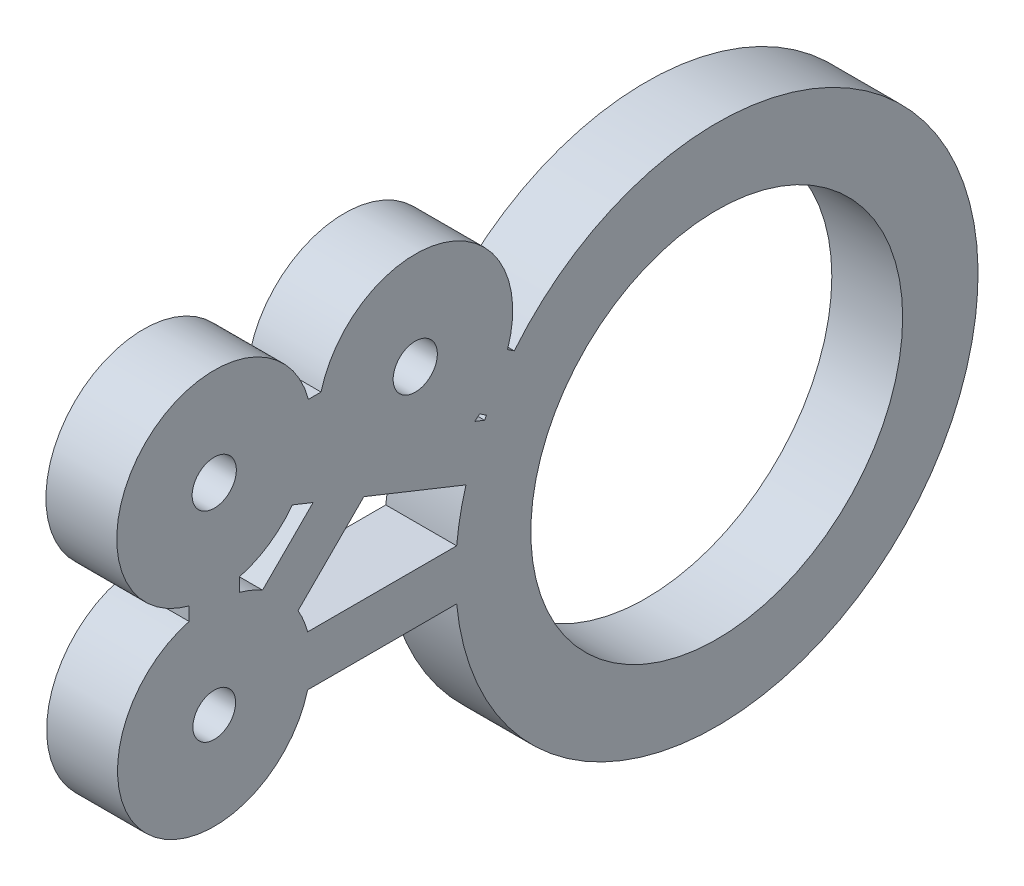
ISO-10303-21;
HEADER;
FILE_DESCRIPTION(('STEP AP214'),'2;1');
FILE_NAME('part.step','',(''),(''),'','','');
FILE_SCHEMA(('AUTOMOTIVE_DESIGN { 1 0 10303 214 1 1 1 1 }'));
ENDSEC;
DATA;
#1=APPLICATION_CONTEXT('core data for automotive mechanical design processes');
#2=APPLICATION_PROTOCOL_DEFINITION('international standard','automotive_design',2000,#1);
#3=PRODUCT_CONTEXT('',#1,'mechanical');
#4=PRODUCT('Part','Part','',(#3));
#5=PRODUCT_RELATED_PRODUCT_CATEGORY('part','',(#4));
#6=PRODUCT_DEFINITION_FORMATION('','',#4);
#7=PRODUCT_DEFINITION_CONTEXT('part definition',#1,'design');
#8=PRODUCT_DEFINITION('design','',#6,#7);
#9=PRODUCT_DEFINITION_SHAPE('','',#8);
#10=(LENGTH_UNIT() NAMED_UNIT(*) SI_UNIT(.MILLI.,.METRE.));
#11=(NAMED_UNIT(*) PLANE_ANGLE_UNIT() SI_UNIT($,.RADIAN.));
#12=(NAMED_UNIT(*) SI_UNIT($,.STERADIAN.) SOLID_ANGLE_UNIT());
#13=UNCERTAINTY_MEASURE_WITH_UNIT(LENGTH_MEASURE(1.E-05),#10,'distance_accuracy_value','');
#14=(GEOMETRIC_REPRESENTATION_CONTEXT(3) GLOBAL_UNCERTAINTY_ASSIGNED_CONTEXT((#13)) GLOBAL_UNIT_ASSIGNED_CONTEXT((#10,
#11,#12)) REPRESENTATION_CONTEXT('',''));
#15=CARTESIAN_POINT('',(0.,0.,0.));
#16=DIRECTION('',(0.,0.,1.));
#17=DIRECTION('',(1.,0.,0.));
#18=AXIS2_PLACEMENT_3D('',#15,#16,#17);
#19=CARTESIAN_POINT('',(75.7735183185999,18.415,-22.225));
#20=DIRECTION('',(-1.,0.,0.));
#21=DIRECTION('',(0.,0.,1.));
#22=AXIS2_PLACEMENT_3D('',#19,#20,#21);
#23=CYLINDRICAL_SURFACE('',#22,1.0795);
#24=CARTESIAN_POINT('',(20.2692,18.415,-22.225));
#25=DIRECTION('',(1.,0.,0.));
#26=DIRECTION('',(0.,0.,-1.));
#27=AXIS2_PLACEMENT_3D('',#24,#25,#26);
#28=CIRCLE('',#27,1.0795);
#29=CARTESIAN_POINT('',(20.2692,18.415,-23.3045));
#30=VERTEX_POINT('',#29);
#31=EDGE_CURVE('E339',#30,#30,#28,.T.);
#32=ORIENTED_EDGE('',*,*,#31,.F.);
#33=EDGE_LOOP('',(#32));
#34=FACE_BOUND('',#33,.T.);
#35=CARTESIAN_POINT('',(23.8506,18.415,-22.225));
#36=DIRECTION('',(1.,0.,0.));
#37=DIRECTION('',(0.,0.,-1.));
#38=AXIS2_PLACEMENT_3D('',#35,#36,#37);
#39=CIRCLE('',#38,1.0795);
#40=CARTESIAN_POINT('',(23.8506,18.415,-23.3045));
#41=VERTEX_POINT('',#40);
#42=EDGE_CURVE('E272',#41,#41,#39,.T.);
#43=ORIENTED_EDGE('',*,*,#42,.T.);
#44=EDGE_LOOP('',(#43));
#45=FACE_BOUND('',#44,.T.);
#46=ADVANCED_FACE('F38',(#34,#45),#23,.F.);
#47=CARTESIAN_POINT('',(75.7735183185999,28.575,-32.385));
#48=DIRECTION('',(-1.,0.,0.));
#49=DIRECTION('',(0.,0.,1.));
#50=AXIS2_PLACEMENT_3D('',#47,#48,#49);
#51=CYLINDRICAL_SURFACE('',#50,1.11759999999999);
#52=CARTESIAN_POINT('',(20.2692,28.575,-32.385));
#53=DIRECTION('',(1.,0.,0.));
#54=DIRECTION('',(0.,0.,-1.));
#55=AXIS2_PLACEMENT_3D('',#52,#53,#54);
#56=CIRCLE('',#55,1.11759999999999);
#57=CARTESIAN_POINT('',(20.2692,28.575,-33.5026));
#58=VERTEX_POINT('',#57);
#59=EDGE_CURVE('E336',#58,#58,#56,.T.);
#60=ORIENTED_EDGE('',*,*,#59,.F.);
#61=EDGE_LOOP('',(#60));
#62=FACE_BOUND('',#61,.T.);
#63=CARTESIAN_POINT('',(23.8506,28.575,-32.385));
#64=DIRECTION('',(1.,0.,0.));
#65=DIRECTION('',(0.,0.,-1.));
#66=AXIS2_PLACEMENT_3D('',#63,#64,#65);
#67=CIRCLE('',#66,1.11759999999999);
#68=CARTESIAN_POINT('',(23.8506,28.575,-33.5026));
#69=VERTEX_POINT('',#68);
#70=EDGE_CURVE('E268',#69,#69,#67,.T.);
#71=ORIENTED_EDGE('',*,*,#70,.T.);
#72=EDGE_LOOP('',(#71));
#73=FACE_BOUND('',#72,.T.);
#74=ADVANCED_FACE('F403',(#62,#73),#51,.F.);
#75=CARTESIAN_POINT('',(75.7735183185999,18.415,-47.625));
#76=DIRECTION('',(-1.,0.,0.));
#77=DIRECTION('',(0.,0.,1.));
#78=AXIS2_PLACEMENT_3D('',#75,#76,#77);
#79=CYLINDRICAL_SURFACE('',#78,9.39800000000001);
#80=CARTESIAN_POINT('',(20.2692,18.415,-47.625));
#81=DIRECTION('',(1.,0.,0.));
#82=DIRECTION('',(0.,0.,-1.));
#83=AXIS2_PLACEMENT_3D('',#80,#81,#82);
#84=CIRCLE('',#83,9.39800000000001);
#85=CARTESIAN_POINT('',(20.2692,18.415,-57.023));
#86=VERTEX_POINT('',#85);
#87=EDGE_CURVE('E333',#86,#86,#84,.F.);
#88=ORIENTED_EDGE('',*,*,#87,.T.);
#89=EDGE_LOOP('',(#88));
#90=FACE_BOUND('',#89,.T.);
#91=CARTESIAN_POINT('',(23.8506,18.415,-47.625));
#92=DIRECTION('',(1.,0.,0.));
#93=DIRECTION('',(0.,0.,-1.));
#94=AXIS2_PLACEMENT_3D('',#91,#92,#93);
#95=CIRCLE('',#94,9.39800000000001);
#96=CARTESIAN_POINT('',(23.8506,18.415,-57.023));
#97=VERTEX_POINT('',#96);
#98=EDGE_CURVE('E11',#97,#97,#95,.F.);
#99=ORIENTED_EDGE('',*,*,#98,.F.);
#100=EDGE_LOOP('',(#99));
#101=FACE_BOUND('',#100,.T.);
#102=ADVANCED_FACE('F409',(#90,#101),#79,.F.);
#103=CARTESIAN_POINT('',(75.7735183185999,18.415,-47.625));
#104=DIRECTION('',(-1.,0.,0.));
#105=DIRECTION('',(0.,0.,1.));
#106=AXIS2_PLACEMENT_3D('',#103,#104,#105);
#107=CYLINDRICAL_SURFACE('',#106,13.208);
#108=CARTESIAN_POINT('',(23.8506,18.415,-47.625));
#109=DIRECTION('',(1.,0.,0.));
#110=DIRECTION('',(0.,0.,-1.));
#111=AXIS2_PLACEMENT_3D('',#108,#109,#110);
#112=CIRCLE('',#111,13.208);
#113=CARTESIAN_POINT('',(23.8506,24.6508289562112,-35.9817315057636));
#114=VERTEX_POINT('',#113);
#115=CARTESIAN_POINT('',(23.8506,24.476764535673,-35.8901683133478));
#116=VERTEX_POINT('',#115);
#117=EDGE_CURVE('E257',#114,#116,#112,.T.);
#118=ORIENTED_EDGE('',*,*,#117,.F.);
#119=DIRECTION('',(-1.,0.,0.));
#120=VECTOR('',#119,1.);
#121=CARTESIAN_POINT('',(75.7735183185999,24.6508289562112,-35.9817315057636));
#122=LINE('',#121,#120);
#123=CARTESIAN_POINT('',(20.2692,24.6508289562112,-35.9817315057636));
#124=VERTEX_POINT('',#123);
#125=EDGE_CURVE('E55',#114,#124,#122,.T.);
#126=ORIENTED_EDGE('',*,*,#125,.T.);
#127=CARTESIAN_POINT('',(20.2692,18.415,-47.625));
#128=DIRECTION('',(1.,0.,0.));
#129=DIRECTION('',(0.,0.,-1.));
#130=AXIS2_PLACEMENT_3D('',#127,#128,#129);
#131=CIRCLE('',#130,13.208);
#132=CARTESIAN_POINT('',(20.2692,24.476764535673,-35.8901683133478));
#133=VERTEX_POINT('',#132);
#134=EDGE_CURVE('E303',#124,#133,#131,.T.);
#135=ORIENTED_EDGE('',*,*,#134,.T.);
#136=DIRECTION('',(-1.,0.,0.));
#137=VECTOR('',#136,1.);
#138=CARTESIAN_POINT('',(75.7735183185999,24.476764535673,-35.8901683133478));
#139=LINE('',#138,#137);
#140=EDGE_CURVE('E344',#116,#133,#139,.T.);
#141=ORIENTED_EDGE('',*,*,#140,.F.);
#142=EDGE_LOOP('',(#118,#126,#135,#141));
#143=FACE_BOUND('',#142,.T.);
#144=ADVANCED_FACE('F420',(#143),#107,.T.);
#145=CARTESIAN_POINT('',(75.7735183185999,33.6729115108063,-22.4486076738708));
#146=DIRECTION('',(0.,0.832050294337844,-0.554700196225228));
#147=DIRECTION('',(0.,0.554700196225228,0.832050294337844));
#148=AXIS2_PLACEMENT_3D('',#145,#146,#147);
#149=PLANE('',#148);
#150=DIRECTION('',(0.,-0.554700196225228,-0.832050294337844));
#151=VECTOR('',#150,1.);
#152=CARTESIAN_POINT('',(23.8506,33.6729115108063,-22.4486076738708));
#153=LINE('',#152,#151);
#154=CARTESIAN_POINT('',(23.8506,24.877297378048,-35.6420288730083));
#155=VERTEX_POINT('',#154);
#156=EDGE_CURVE('E260',#155,#114,#153,.T.);
#157=ORIENTED_EDGE('',*,*,#156,.F.);
#158=DIRECTION('',(-1.,0.,0.));
#159=VECTOR('',#158,1.);
#160=CARTESIAN_POINT('',(75.7735183185999,24.877297378048,-35.6420288730083));
#161=LINE('',#160,#159);
#162=CARTESIAN_POINT('',(20.2692,24.877297378048,-35.6420288730083));
#163=VERTEX_POINT('',#162);
#164=EDGE_CURVE('E348',#155,#163,#161,.T.);
#165=ORIENTED_EDGE('',*,*,#164,.T.);
#166=DIRECTION('',(0.,-0.554700196225228,-0.832050294337844));
#167=VECTOR('',#166,1.);
#168=CARTESIAN_POINT('',(20.2692,33.6729115108063,-22.4486076738708));
#169=LINE('',#168,#167);
#170=EDGE_CURVE('E331',#163,#124,#169,.T.);
#171=ORIENTED_EDGE('',*,*,#170,.T.);
#172=ORIENTED_EDGE('',*,*,#125,.F.);
#173=EDGE_LOOP('',(#157,#165,#171,#172));
#174=FACE_BOUND('',#173,.T.);
#175=ADVANCED_FACE('F428',(#174),#149,.F.);
#176=CARTESIAN_POINT('',(75.7735183185999,28.575,-32.385));
#177=DIRECTION('',(-1.,0.,0.));
#178=DIRECTION('',(0.,0.,1.));
#179=AXIS2_PLACEMENT_3D('',#176,#177,#178);
#180=CYLINDRICAL_SURFACE('',#179,4.92759999999999);
#181=CARTESIAN_POINT('',(23.8506,28.575,-32.385));
#182=DIRECTION('',(1.,0.,0.));
#183=DIRECTION('',(0.,0.,-1.));
#184=AXIS2_PLACEMENT_3D('',#181,#182,#183);
#185=CIRCLE('',#184,4.92759999999999);
#186=CARTESIAN_POINT('',(23.8506,24.6744017182742,-35.3960753568448));
#187=VERTEX_POINT('',#186);
#188=EDGE_CURVE('E263',#187,#155,#185,.T.);
#189=ORIENTED_EDGE('',*,*,#188,.F.);
#190=DIRECTION('',(-1.,0.,0.));
#191=VECTOR('',#190,1.);
#192=CARTESIAN_POINT('',(75.7735183185999,24.6744017182742,-35.3960753568448));
#193=LINE('',#192,#191);
#194=CARTESIAN_POINT('',(20.2692,24.6744017182742,-35.3960753568448));
#195=VERTEX_POINT('',#194);
#196=EDGE_CURVE('E47',#187,#195,#193,.T.);
#197=ORIENTED_EDGE('',*,*,#196,.T.);
#198=CARTESIAN_POINT('',(20.2692,28.575,-32.385));
#199=DIRECTION('',(1.,0.,0.));
#200=DIRECTION('',(0.,0.,-1.));
#201=AXIS2_PLACEMENT_3D('',#198,#199,#200);
#202=CIRCLE('',#201,4.92759999999999);
#203=EDGE_CURVE('E328',#195,#163,#202,.T.);
#204=ORIENTED_EDGE('',*,*,#203,.T.);
#205=ORIENTED_EDGE('',*,*,#164,.F.);
#206=EDGE_LOOP('',(#189,#197,#204,#205));
#207=FACE_BOUND('',#206,.T.);
#208=ADVANCED_FACE('F431',(#207),#180,.T.);
#209=CARTESIAN_POINT('',(75.7735183185999,33.4765791905277,-13.3906316762111));
#210=DIRECTION('',(0.,0.928476690885259,-0.371390676354104));
#211=DIRECTION('',(0.,0.371390676354104,0.928476690885259));
#212=AXIS2_PLACEMENT_3D('',#209,#210,#211);
#213=PLANE('',#212);
#214=ORIENTED_EDGE('',*,*,#196,.F.);
#215=DIRECTION('',(0.,-0.371390676354104,-0.928476690885259));
#216=VECTOR('',#215,1.);
#217=CARTESIAN_POINT('',(23.8506,33.4765791905277,-13.3906316762111));
#218=LINE('',#217,#216);
#219=EDGE_CURVE('E266',#187,#116,#218,.T.);
#220=ORIENTED_EDGE('',*,*,#219,.T.);
#221=ORIENTED_EDGE('',*,*,#140,.T.);
#222=DIRECTION('',(0.,-0.371390676354104,-0.928476690885259));
#223=VECTOR('',#222,1.);
#224=CARTESIAN_POINT('',(20.2692,33.4765791905277,-13.3906316762111));
#225=LINE('',#224,#223);
#226=EDGE_CURVE('E325',#195,#133,#225,.T.);
#227=ORIENTED_EDGE('',*,*,#226,.F.);
#228=EDGE_LOOP('',(#214,#220,#221,#227));
#229=FACE_BOUND('',#228,.T.);
#230=ADVANCED_FACE('F434',(#229),#213,.T.);
#231=CARTESIAN_POINT('',(75.7735183185999,19.685,0.));
#232=DIRECTION('',(0.,-1.,0.));
#233=DIRECTION('',(0.,0.,-1.));
#234=AXIS2_PLACEMENT_3D('',#231,#232,#233);
#235=PLANE('',#234);
#236=DIRECTION('',(0.,0.,1.));
#237=VECTOR('',#236,1.);
#238=CARTESIAN_POINT('',(23.8506,19.685,0.));
#239=LINE('',#238,#237);
#240=CARTESIAN_POINT('',(23.8506,19.685,-34.4781994766787));
#241=VERTEX_POINT('',#240);
#242=CARTESIAN_POINT('',(23.8506,19.685,-26.9466851070354));
#243=VERTEX_POINT('',#242);
#244=EDGE_CURVE('E242',#241,#243,#239,.T.);
#245=ORIENTED_EDGE('',*,*,#244,.F.);
#246=DIRECTION('',(-1.,0.,0.));
#247=VECTOR('',#246,1.);
#248=CARTESIAN_POINT('',(75.7735183185999,19.685,-34.4781994766788));
#249=LINE('',#248,#247);
#250=CARTESIAN_POINT('',(20.2692,19.685,-34.4781994766787));
#251=VERTEX_POINT('',#250);
#252=EDGE_CURVE('E63',#241,#251,#249,.T.);
#253=ORIENTED_EDGE('',*,*,#252,.T.);
#254=DIRECTION('',(0.,0.,1.));
#255=VECTOR('',#254,1.);
#256=CARTESIAN_POINT('',(20.2692,19.685,0.));
#257=LINE('',#256,#255);
#258=CARTESIAN_POINT('',(20.2692,19.685,-26.9466851070354));
#259=VERTEX_POINT('',#258);
#260=EDGE_CURVE('E322',#251,#259,#257,.T.);
#261=ORIENTED_EDGE('',*,*,#260,.T.);
#262=DIRECTION('',(-1.,0.,0.));
#263=VECTOR('',#262,1.);
#264=CARTESIAN_POINT('',(75.7735183185999,19.685,-26.9466851070354));
#265=LINE('',#264,#263);
#266=EDGE_CURVE('E351',#243,#259,#265,.T.);
#267=ORIENTED_EDGE('',*,*,#266,.F.);
#268=EDGE_LOOP('',(#245,#253,#261,#267));
#269=FACE_BOUND('',#268,.T.);
#270=ADVANCED_FACE('F426',(#269),#235,.F.);
#271=CARTESIAN_POINT('',(23.8506,18.415,-47.625));
#272=DIRECTION('',(1.,0.,0.));
#273=DIRECTION('',(0.,0.,-1.));
#274=AXIS2_PLACEMENT_3D('',#271,#272,#273);
#275=CIRCLE('',#274,13.208);
#276=CARTESIAN_POINT('',(23.8506,22.1184337408245,-34.9468359954084));
#277=VERTEX_POINT('',#276);
#278=EDGE_CURVE('E245',#277,#241,#275,.T.);
#279=ORIENTED_EDGE('',*,*,#278,.F.);
#280=DIRECTION('',(-1.,0.,0.));
#281=VECTOR('',#280,1.);
#282=CARTESIAN_POINT('',(75.7735183185999,22.1184337408245,-34.9468359954084));
#283=LINE('',#282,#281);
#284=CARTESIAN_POINT('',(20.2692,22.1184337408245,-34.9468359954084));
#285=VERTEX_POINT('',#284);
#286=EDGE_CURVE('E355',#277,#285,#283,.T.);
#287=ORIENTED_EDGE('',*,*,#286,.T.);
#288=EDGE_CURVE('E304',#285,#251,#131,.T.);
#289=ORIENTED_EDGE('',*,*,#288,.T.);
#290=ORIENTED_EDGE('',*,*,#252,.F.);
#291=EDGE_LOOP('',(#279,#287,#289,#290));
#292=FACE_BOUND('',#291,.T.);
#293=ADVANCED_FACE('F422',(#292),#107,.T.);
#294=CARTESIAN_POINT('',(75.7735183185999,31.1182483956792,-12.4472993582717));
#295=DIRECTION('',(0.,0.928476690885259,-0.371390676354104));
#296=DIRECTION('',(0.,0.371390676354104,0.928476690885259));
#297=AXIS2_PLACEMENT_3D('',#294,#295,#296);
#298=PLANE('',#297);
#299=DIRECTION('',(0.,-0.371390676354104,-0.928476690885259));
#300=VECTOR('',#299,1.);
#301=CARTESIAN_POINT('',(23.8506,31.1182483956792,-12.4472993582717));
#302=LINE('',#301,#300);
#303=CARTESIAN_POINT('',(23.8506,24.1819626066445,-29.7880138308583));
#304=VERTEX_POINT('',#303);
#305=EDGE_CURVE('E248',#304,#277,#302,.T.);
#306=ORIENTED_EDGE('',*,*,#305,.F.);
#307=DIRECTION('',(-1.,0.,0.));
#308=VECTOR('',#307,1.);
#309=CARTESIAN_POINT('',(75.7735183185999,24.1819626066445,-29.7880138308584));
#310=LINE('',#309,#308);
#311=CARTESIAN_POINT('',(20.2692,24.1819626066445,-29.7880138308583));
#312=VERTEX_POINT('',#311);
#313=EDGE_CURVE('E357',#304,#312,#310,.T.);
#314=ORIENTED_EDGE('',*,*,#313,.T.);
#315=DIRECTION('',(0.,-0.371390676354104,-0.928476690885259));
#316=VECTOR('',#315,1.);
#317=CARTESIAN_POINT('',(20.2692,31.1182483956792,-12.4472993582717));
#318=LINE('',#317,#316);
#319=EDGE_CURVE('E319',#312,#285,#318,.T.);
#320=ORIENTED_EDGE('',*,*,#319,.T.);
#321=ORIENTED_EDGE('',*,*,#286,.F.);
#322=EDGE_LOOP('',(#306,#314,#320,#321));
#323=FACE_BOUND('',#322,.T.);
#324=ADVANCED_FACE('F425',(#323),#298,.F.);
#325=CARTESIAN_POINT('',(75.7735183185999,-2.8030256121069,-2.80302561210691));
#326=DIRECTION('',(0.,0.707106781186548,0.707106781186547));
#327=DIRECTION('',(0.,-0.707106781186547,0.707106781186548));
#328=AXIS2_PLACEMENT_3D('',#325,#326,#327);
#329=PLANE('',#328);
#330=DIRECTION('',(0.,0.707106781186547,-0.707106781186548));
#331=VECTOR('',#330,1.);
#332=CARTESIAN_POINT('',(23.8506,-2.8030256121069,-2.8030256121069));
#333=LINE('',#332,#331);
#334=CARTESIAN_POINT('',(23.8506,20.8557099457054,-26.4617611699192));
#335=VERTEX_POINT('',#334);
#336=EDGE_CURVE('E251',#335,#304,#333,.T.);
#337=ORIENTED_EDGE('',*,*,#336,.F.);
#338=DIRECTION('',(-1.,0.,0.));
#339=VECTOR('',#338,1.);
#340=CARTESIAN_POINT('',(75.7735183185999,20.8557099457054,-26.4617611699192));
#341=LINE('',#340,#339);
#342=CARTESIAN_POINT('',(20.2692,20.8557099457054,-26.4617611699192));
#343=VERTEX_POINT('',#342);
#344=EDGE_CURVE('E346',#335,#343,#341,.T.);
#345=ORIENTED_EDGE('',*,*,#344,.T.);
#346=DIRECTION('',(0.,0.707106781186547,-0.707106781186548));
#347=VECTOR('',#346,1.);
#348=CARTESIAN_POINT('',(20.2692,-2.8030256121069,-2.8030256121069));
#349=LINE('',#348,#347);
#350=EDGE_CURVE('E316',#343,#312,#349,.T.);
#351=ORIENTED_EDGE('',*,*,#350,.T.);
#352=ORIENTED_EDGE('',*,*,#313,.F.);
#353=EDGE_LOOP('',(#337,#345,#351,#352));
#354=FACE_BOUND('',#353,.T.);
#355=ADVANCED_FACE('F444',(#354),#329,.F.);
#356=CARTESIAN_POINT('',(75.7735183185999,18.415,-22.225));
#357=DIRECTION('',(-1.,0.,0.));
#358=DIRECTION('',(0.,0.,1.));
#359=AXIS2_PLACEMENT_3D('',#356,#357,#358);
#360=CYLINDRICAL_SURFACE('',#359,4.8895);
#361=CARTESIAN_POINT('',(23.8506,18.415,-22.225));
#362=DIRECTION('',(1.,0.,0.));
#363=DIRECTION('',(0.,0.,-1.));
#364=AXIS2_PLACEMENT_3D('',#361,#362,#363);
#365=CIRCLE('',#364,4.8895);
#366=EDGE_CURVE('E254',#243,#335,#365,.T.);
#367=ORIENTED_EDGE('',*,*,#366,.F.);
#368=ORIENTED_EDGE('',*,*,#266,.T.);
#369=CARTESIAN_POINT('',(20.2692,18.415,-22.225));
#370=DIRECTION('',(1.,0.,0.));
#371=DIRECTION('',(0.,0.,-1.));
#372=AXIS2_PLACEMENT_3D('',#369,#370,#371);
#373=CIRCLE('',#372,4.8895);
#374=EDGE_CURVE('E313',#259,#343,#373,.T.);
#375=ORIENTED_EDGE('',*,*,#374,.T.);
#376=ORIENTED_EDGE('',*,*,#344,.F.);
#377=EDGE_LOOP('',(#367,#368,#375,#376));
#378=FACE_BOUND('',#377,.T.);
#379=ADVANCED_FACE('F448',(#378),#360,.T.);
#380=CARTESIAN_POINT('',(75.7735183185999,29.845,0.));
#381=DIRECTION('',(0.,1.,0.));
#382=DIRECTION('',(0.,0.,1.));
#383=AXIS2_PLACEMENT_3D('',#380,#381,#382);
#384=PLANE('',#383);
#385=DIRECTION('',(-1.,0.,0.));
#386=VECTOR('',#385,1.);
#387=CARTESIAN_POINT('',(75.7735183185999,29.845,-26.9861282024327));
#388=LINE('',#387,#386);
#389=CARTESIAN_POINT('',(23.8506,29.845,-26.9861282024327));
#390=VERTEX_POINT('',#389);
#391=CARTESIAN_POINT('',(20.2692,29.845,-26.9861282024327));
#392=VERTEX_POINT('',#391);
#393=EDGE_CURVE('E360',#390,#392,#388,.T.);
#394=ORIENTED_EDGE('',*,*,#393,.F.);
#395=DIRECTION('',(0.,0.,-1.));
#396=VECTOR('',#395,1.);
#397=CARTESIAN_POINT('',(23.8506,29.845,0.));
#398=LINE('',#397,#396);
#399=CARTESIAN_POINT('',(23.8506,29.845,-27.6238717975673));
#400=VERTEX_POINT('',#399);
#401=EDGE_CURVE('E209',#390,#400,#398,.T.);
#402=ORIENTED_EDGE('',*,*,#401,.T.);
#403=DIRECTION('',(-1.,0.,0.));
#404=VECTOR('',#403,1.);
#405=CARTESIAN_POINT('',(75.7735183185999,29.845,-27.6238717975673));
#406=LINE('',#405,#404);
#407=CARTESIAN_POINT('',(20.2692,29.845,-27.6238717975673));
#408=VERTEX_POINT('',#407);
#409=EDGE_CURVE('E362',#400,#408,#406,.T.);
#410=ORIENTED_EDGE('',*,*,#409,.T.);
#411=DIRECTION('',(0.,0.,-1.));
#412=VECTOR('',#411,1.);
#413=CARTESIAN_POINT('',(20.2692,29.845,0.));
#414=LINE('',#413,#412);
#415=EDGE_CURVE('E310',#392,#408,#414,.T.);
#416=ORIENTED_EDGE('',*,*,#415,.F.);
#417=EDGE_LOOP('',(#394,#402,#410,#416));
#418=FACE_BOUND('',#417,.T.);
#419=ADVANCED_FACE('F452',(#418),#384,.T.);
#420=CARTESIAN_POINT('',(75.7735183185999,28.575,-32.385));
#421=DIRECTION('',(-1.,0.,0.));
#422=DIRECTION('',(0.,0.,1.));
#423=AXIS2_PLACEMENT_3D('',#420,#421,#422);
#424=CYLINDRICAL_SURFACE('',#423,4.92759999999999);
#425=CARTESIAN_POINT('',(23.8506,28.575,-32.385));
#426=DIRECTION('',(1.,0.,0.));
#427=DIRECTION('',(0.,0.,-1.));
#428=AXIS2_PLACEMENT_3D('',#425,#426,#427);
#429=CIRCLE('',#428,4.92759999999999);
#430=CARTESIAN_POINT('',(23.8506,26.9907051256662,-37.0509673714204));
#431=VERTEX_POINT('',#430);
#432=EDGE_CURVE('E225',#431,#400,#429,.T.);
#433=ORIENTED_EDGE('',*,*,#432,.F.);
#434=DIRECTION('',(-1.,0.,0.));
#435=VECTOR('',#434,1.);
#436=CARTESIAN_POINT('',(75.7735183185999,26.9907051256662,-37.0509673714204));
#437=LINE('',#436,#435);
#438=CARTESIAN_POINT('',(20.2692,26.9907051256662,-37.0509673714204));
#439=VERTEX_POINT('',#438);
#440=EDGE_CURVE('E364',#431,#439,#437,.T.);
#441=ORIENTED_EDGE('',*,*,#440,.T.);
#442=CARTESIAN_POINT('',(20.2692,28.575,-32.385));
#443=DIRECTION('',(1.,0.,0.));
#444=DIRECTION('',(0.,0.,-1.));
#445=AXIS2_PLACEMENT_3D('',#442,#443,#444);
#446=CIRCLE('',#445,4.92759999999999);
#447=EDGE_CURVE('E307',#439,#408,#446,.T.);
#448=ORIENTED_EDGE('',*,*,#447,.T.);
#449=ORIENTED_EDGE('',*,*,#409,.F.);
#450=EDGE_LOOP('',(#433,#441,#448,#449));
#451=FACE_BOUND('',#450,.T.);
#452=ADVANCED_FACE('F456',(#451),#424,.T.);
#453=CARTESIAN_POINT('',(75.7735183185999,35.7863192584245,-23.8575461722829));
#454=DIRECTION('',(0.,0.832050294337844,-0.554700196225228));
#455=DIRECTION('',(0.,0.554700196225228,0.832050294337845));
#456=AXIS2_PLACEMENT_3D('',#453,#454,#455);
#457=PLANE('',#456);
#458=ORIENTED_EDGE('',*,*,#440,.F.);
#459=DIRECTION('',(0.,-0.554700196225228,-0.832050294337845));
#460=VECTOR('',#459,1.);
#461=CARTESIAN_POINT('',(23.8506,35.7863192584245,-23.8575461722829));
#462=LINE('',#461,#460);
#463=CARTESIAN_POINT('',(23.8506,26.7642367038293,-37.3906700041757));
#464=VERTEX_POINT('',#463);
#465=EDGE_CURVE('E227',#431,#464,#462,.T.);
#466=ORIENTED_EDGE('',*,*,#465,.T.);
#467=DIRECTION('',(-1.,0.,0.));
#468=VECTOR('',#467,1.);
#469=CARTESIAN_POINT('',(75.7735183185999,26.7642367038293,-37.3906700041757));
#470=LINE('',#469,#468);
#471=CARTESIAN_POINT('',(20.2692,26.7642367038293,-37.3906700041757));
#472=VERTEX_POINT('',#471);
#473=EDGE_CURVE('E366',#464,#472,#470,.T.);
#474=ORIENTED_EDGE('',*,*,#473,.T.);
#475=DIRECTION('',(0.,-0.554700196225228,-0.832050294337844));
#476=VECTOR('',#475,1.);
#477=CARTESIAN_POINT('',(20.2692,35.7863192584245,-23.8575461722829));
#478=LINE('',#477,#476);
#479=EDGE_CURVE('E302',#439,#472,#478,.T.);
#480=ORIENTED_EDGE('',*,*,#479,.F.);
#481=EDGE_LOOP('',(#458,#466,#474,#480));
#482=FACE_BOUND('',#481,.T.);
#483=ADVANCED_FACE('F460',(#482),#457,.T.);
#484=CARTESIAN_POINT('',(23.8506,18.415,-47.625));
#485=DIRECTION('',(1.,0.,0.));
#486=DIRECTION('',(0.,0.,-1.));
#487=AXIS2_PLACEMENT_3D('',#484,#485,#486);
#488=CIRCLE('',#487,13.208);
#489=CARTESIAN_POINT('',(23.8506,17.145,-34.4781994766787));
#490=VERTEX_POINT('',#489);
#491=EDGE_CURVE('E230',#490,#464,#488,.T.);
#492=ORIENTED_EDGE('',*,*,#491,.F.);
#493=DIRECTION('',(-1.,0.,0.));
#494=VECTOR('',#493,1.);
#495=CARTESIAN_POINT('',(75.7735183185999,17.145,-34.4781994766788));
#496=LINE('',#495,#494);
#497=CARTESIAN_POINT('',(20.2692,17.145,-34.4781994766787));
#498=VERTEX_POINT('',#497);
#499=EDGE_CURVE('E368',#490,#498,#496,.T.);
#500=ORIENTED_EDGE('',*,*,#499,.T.);
#501=EDGE_CURVE('E299',#498,#472,#131,.T.);
#502=ORIENTED_EDGE('',*,*,#501,.T.);
#503=ORIENTED_EDGE('',*,*,#473,.F.);
#504=EDGE_LOOP('',(#492,#500,#502,#503));
#505=FACE_BOUND('',#504,.T.);
#506=ADVANCED_FACE('F427',(#505),#107,.T.);
#507=CARTESIAN_POINT('',(75.7735183185999,17.145,0.));
#508=DIRECTION('',(0.,-1.,0.));
#509=DIRECTION('',(0.,0.,-1.));
#510=AXIS2_PLACEMENT_3D('',#507,#508,#509);
#511=PLANE('',#510);
#512=ORIENTED_EDGE('',*,*,#499,.F.);
#513=DIRECTION('',(0.,0.,1.));
#514=VECTOR('',#513,1.);
#515=CARTESIAN_POINT('',(23.8506,17.145,0.));
#516=LINE('',#515,#514);
#517=CARTESIAN_POINT('',(23.8506,17.145,-26.9466851070354));
#518=VERTEX_POINT('',#517);
#519=EDGE_CURVE('E232',#490,#518,#516,.T.);
#520=ORIENTED_EDGE('',*,*,#519,.T.);
#521=DIRECTION('',(-1.,0.,0.));
#522=VECTOR('',#521,1.);
#523=CARTESIAN_POINT('',(75.7735183185999,17.145,-26.9466851070354));
#524=LINE('',#523,#522);
#525=CARTESIAN_POINT('',(20.2692,17.145,-26.9466851070354));
#526=VERTEX_POINT('',#525);
#527=EDGE_CURVE('E370',#518,#526,#524,.T.);
#528=ORIENTED_EDGE('',*,*,#527,.T.);
#529=DIRECTION('',(0.,0.,1.));
#530=VECTOR('',#529,1.);
#531=CARTESIAN_POINT('',(20.2692,17.145,0.));
#532=LINE('',#531,#530);
#533=EDGE_CURVE('E296',#498,#526,#532,.T.);
#534=ORIENTED_EDGE('',*,*,#533,.F.);
#535=EDGE_LOOP('',(#512,#520,#528,#534));
#536=FACE_BOUND('',#535,.T.);
#537=ADVANCED_FACE('F465',(#536),#511,.T.);
#538=CARTESIAN_POINT('',(75.7735183185999,18.415,-22.225));
#539=DIRECTION('',(-1.,0.,0.));
#540=DIRECTION('',(0.,0.,1.));
#541=AXIS2_PLACEMENT_3D('',#538,#539,#540);
#542=CYLINDRICAL_SURFACE('',#541,4.8895);
#543=CARTESIAN_POINT('',(23.8506,18.415,-22.225));
#544=DIRECTION('',(1.,0.,0.));
#545=DIRECTION('',(0.,0.,-1.));
#546=AXIS2_PLACEMENT_3D('',#543,#544,#545);
#547=CIRCLE('',#546,4.8895);
#548=CARTESIAN_POINT('',(23.8506,23.1366851070354,-20.955));
#549=VERTEX_POINT('',#548);
#550=EDGE_CURVE('E235',#549,#518,#547,.T.);
#551=ORIENTED_EDGE('',*,*,#550,.F.);
#552=DIRECTION('',(-1.,0.,0.));
#553=VECTOR('',#552,1.);
#554=CARTESIAN_POINT('',(75.7735183185999,23.1366851070354,-20.955));
#555=LINE('',#554,#553);
#556=CARTESIAN_POINT('',(20.2692,23.1366851070354,-20.955));
#557=VERTEX_POINT('',#556);
#558=EDGE_CURVE('E372',#549,#557,#555,.T.);
#559=ORIENTED_EDGE('',*,*,#558,.T.);
#560=CARTESIAN_POINT('',(20.2692,18.415,-22.225));
#561=DIRECTION('',(1.,0.,0.));
#562=DIRECTION('',(0.,0.,-1.));
#563=AXIS2_PLACEMENT_3D('',#560,#561,#562);
#564=CIRCLE('',#563,4.8895);
#565=EDGE_CURVE('E293',#557,#526,#564,.T.);
#566=ORIENTED_EDGE('',*,*,#565,.T.);
#567=ORIENTED_EDGE('',*,*,#527,.F.);
#568=EDGE_LOOP('',(#551,#559,#566,#567));
#569=FACE_BOUND('',#568,.T.);
#570=ADVANCED_FACE('F468',(#569),#542,.T.);
#571=CARTESIAN_POINT('',(75.7735183185999,0.,-20.955));
#572=DIRECTION('',(0.,0.,1.));
#573=DIRECTION('',(1.,0.,0.));
#574=AXIS2_PLACEMENT_3D('',#571,#572,#573);
#575=PLANE('',#574);
#576=ORIENTED_EDGE('',*,*,#558,.F.);
#577=DIRECTION('',(0.,1.,0.));
#578=VECTOR('',#577,1.);
#579=CARTESIAN_POINT('',(23.8506,0.,-20.955));
#580=LINE('',#579,#578);
#581=CARTESIAN_POINT('',(23.8506,23.8138717975673,-20.955));
#582=VERTEX_POINT('',#581);
#583=EDGE_CURVE('E237',#549,#582,#580,.T.);
#584=ORIENTED_EDGE('',*,*,#583,.T.);
#585=DIRECTION('',(-1.,0.,0.));
#586=VECTOR('',#585,1.);
#587=CARTESIAN_POINT('',(75.7735183185999,23.8138717975673,-20.955));
#588=LINE('',#587,#586);
#589=CARTESIAN_POINT('',(20.2692,23.8138717975673,-20.955));
#590=VERTEX_POINT('',#589);
#591=EDGE_CURVE('E353',#582,#590,#588,.T.);
#592=ORIENTED_EDGE('',*,*,#591,.T.);
#593=DIRECTION('',(0.,1.,0.));
#594=VECTOR('',#593,1.);
#595=CARTESIAN_POINT('',(20.2692,0.,-20.955));
#596=LINE('',#595,#594);
#597=EDGE_CURVE('E290',#557,#590,#596,.T.);
#598=ORIENTED_EDGE('',*,*,#597,.F.);
#599=EDGE_LOOP('',(#576,#584,#592,#598));
#600=FACE_BOUND('',#599,.T.);
#601=ADVANCED_FACE('F472',(#600),#575,.T.);
#602=CARTESIAN_POINT('',(75.7735183185999,28.575,-22.225));
#603=DIRECTION('',(-1.,0.,0.));
#604=DIRECTION('',(0.,0.,1.));
#605=AXIS2_PLACEMENT_3D('',#602,#603,#604);
#606=CYLINDRICAL_SURFACE('',#605,4.9276);
#607=CARTESIAN_POINT('',(23.8506,28.575,-22.225));
#608=DIRECTION('',(1.,0.,0.));
#609=DIRECTION('',(0.,0.,-1.));
#610=AXIS2_PLACEMENT_3D('',#607,#608,#609);
#611=CIRCLE('',#610,4.9276);
#612=EDGE_CURVE('E240',#390,#582,#611,.T.);
#613=ORIENTED_EDGE('',*,*,#612,.F.);
#614=ORIENTED_EDGE('',*,*,#393,.T.);
#615=CARTESIAN_POINT('',(20.2692,28.575,-22.225));
#616=DIRECTION('',(1.,0.,0.));
#617=DIRECTION('',(0.,0.,-1.));
#618=AXIS2_PLACEMENT_3D('',#615,#616,#617);
#619=CIRCLE('',#618,4.9276);
#620=EDGE_CURVE('E287',#392,#590,#619,.T.);
#621=ORIENTED_EDGE('',*,*,#620,.T.);
#622=ORIENTED_EDGE('',*,*,#591,.F.);
#623=EDGE_LOOP('',(#613,#614,#621,#622));
#624=FACE_BOUND('',#623,.T.);
#625=ADVANCED_FACE('F400',(#624),#606,.T.);
#626=CARTESIAN_POINT('',(75.7735183185999,0.,-23.495));
#627=DIRECTION('',(0.,0.,1.));
#628=DIRECTION('',(1.,0.,0.));
#629=AXIS2_PLACEMENT_3D('',#626,#627,#628);
#630=PLANE('',#629);
#631=DIRECTION('',(0.,1.,0.));
#632=VECTOR('',#631,1.);
#633=CARTESIAN_POINT('',(23.8506,0.,-23.495));
#634=LINE('',#633,#632);
#635=CARTESIAN_POINT('',(23.8506,23.1366851070354,-23.495));
#636=VERTEX_POINT('',#635);
#637=CARTESIAN_POINT('',(23.8506,23.8138717975673,-23.495));
#638=VERTEX_POINT('',#637);
#639=EDGE_CURVE('E193',#636,#638,#634,.T.);
#640=ORIENTED_EDGE('',*,*,#639,.F.);
#641=DIRECTION('',(-1.,0.,0.));
#642=VECTOR('',#641,1.);
#643=CARTESIAN_POINT('',(75.7735183185999,23.1366851070354,-23.495));
#644=LINE('',#643,#642);
#645=CARTESIAN_POINT('',(20.2692,23.1366851070354,-23.495));
#646=VERTEX_POINT('',#645);
#647=EDGE_CURVE('E200',#636,#646,#644,.T.);
#648=ORIENTED_EDGE('',*,*,#647,.T.);
#649=DIRECTION('',(0.,1.,0.));
#650=VECTOR('',#649,1.);
#651=CARTESIAN_POINT('',(20.2692,0.,-23.495));
#652=LINE('',#651,#650);
#653=CARTESIAN_POINT('',(20.2692,23.8138717975673,-23.495));
#654=VERTEX_POINT('',#653);
#655=EDGE_CURVE('E196',#646,#654,#652,.T.);
#656=ORIENTED_EDGE('',*,*,#655,.T.);
#657=DIRECTION('',(-1.,0.,0.));
#658=VECTOR('',#657,1.);
#659=CARTESIAN_POINT('',(75.7735183185999,23.8138717975673,-23.495));
#660=LINE('',#659,#658);
#661=EDGE_CURVE('E189',#638,#654,#660,.T.);
#662=ORIENTED_EDGE('',*,*,#661,.F.);
#663=EDGE_LOOP('',(#640,#648,#656,#662));
#664=FACE_BOUND('',#663,.T.);
#665=ADVANCED_FACE('F191',(#664),#630,.F.);
#666=CARTESIAN_POINT('',(75.7735183185999,18.415,-22.225));
#667=DIRECTION('',(-1.,0.,0.));
#668=DIRECTION('',(0.,0.,1.));
#669=AXIS2_PLACEMENT_3D('',#666,#667,#668);
#670=CYLINDRICAL_SURFACE('',#669,4.8895);
#671=CARTESIAN_POINT('',(23.8506,18.415,-22.225));
#672=DIRECTION('',(1.,0.,0.));
#673=DIRECTION('',(0.,0.,-1.));
#674=AXIS2_PLACEMENT_3D('',#671,#672,#673);
#675=CIRCLE('',#674,4.8895);
#676=CARTESIAN_POINT('',(23.8506,22.6517611699192,-24.6657099457054));
#677=VERTEX_POINT('',#676);
#678=EDGE_CURVE('E215',#677,#636,#675,.T.);
#679=ORIENTED_EDGE('',*,*,#678,.F.);
#680=DIRECTION('',(-1.,0.,0.));
#681=VECTOR('',#680,1.);
#682=CARTESIAN_POINT('',(75.7735183185999,22.6517611699192,-24.6657099457054));
#683=LINE('',#682,#681);
#684=CARTESIAN_POINT('',(20.2692,22.6517611699192,-24.6657099457054));
#685=VERTEX_POINT('',#684);
#686=EDGE_CURVE('E376',#677,#685,#683,.T.);
#687=ORIENTED_EDGE('',*,*,#686,.T.);
#688=CARTESIAN_POINT('',(20.2692,18.415,-22.225));
#689=DIRECTION('',(1.,0.,0.));
#690=DIRECTION('',(0.,0.,-1.));
#691=AXIS2_PLACEMENT_3D('',#688,#689,#690);
#692=CIRCLE('',#691,4.8895);
#693=EDGE_CURVE('E283',#685,#646,#692,.T.);
#694=ORIENTED_EDGE('',*,*,#693,.T.);
#695=ORIENTED_EDGE('',*,*,#647,.F.);
#696=EDGE_LOOP('',(#679,#687,#694,#695));
#697=FACE_BOUND('',#696,.T.);
#698=ADVANCED_FACE('F392',(#697),#670,.T.);
#699=CARTESIAN_POINT('',(75.7735183185999,-1.00697438789308,-1.00697438789309));
#700=DIRECTION('',(0.,0.707106781186548,0.707106781186547));
#701=DIRECTION('',(0.,-0.707106781186547,0.707106781186548));
#702=AXIS2_PLACEMENT_3D('',#699,#700,#701);
#703=PLANE('',#702);
#704=ORIENTED_EDGE('',*,*,#686,.F.);
#705=DIRECTION('',(0.,0.707106781186547,-0.707106781186548));
#706=VECTOR('',#705,1.);
#707=CARTESIAN_POINT('',(23.8506,-1.00697438789308,-1.00697438789308));
#708=LINE('',#707,#706);
#709=CARTESIAN_POINT('',(23.8506,25.2082775919095,-27.2222263676957));
#710=VERTEX_POINT('',#709);
#711=EDGE_CURVE('E217',#677,#710,#708,.T.);
#712=ORIENTED_EDGE('',*,*,#711,.T.);
#713=DIRECTION('',(-1.,0.,0.));
#714=VECTOR('',#713,1.);
#715=CARTESIAN_POINT('',(75.7735183185999,25.2082775919095,-27.2222263676957));
#716=LINE('',#715,#714);
#717=CARTESIAN_POINT('',(20.2692,25.2082775919095,-27.2222263676957));
#718=VERTEX_POINT('',#717);
#719=EDGE_CURVE('E378',#710,#718,#716,.T.);
#720=ORIENTED_EDGE('',*,*,#719,.T.);
#721=DIRECTION('',(0.,0.707106781186547,-0.707106781186548));
#722=VECTOR('',#721,1.);
#723=CARTESIAN_POINT('',(20.2692,-1.00697438789308,-1.00697438789308));
#724=LINE('',#723,#722);
#725=EDGE_CURVE('E280',#685,#718,#724,.T.);
#726=ORIENTED_EDGE('',*,*,#725,.F.);
#727=EDGE_LOOP('',(#704,#712,#720,#726));
#728=FACE_BOUND('',#727,.T.);
#729=ADVANCED_FACE('F390',(#728),#703,.T.);
#730=CARTESIAN_POINT('',(75.7735183185999,31.1182483956792,-12.4472993582717));
#731=DIRECTION('',(0.,0.928476690885259,-0.371390676354104));
#732=DIRECTION('',(0.,0.371390676354104,0.928476690885259));
#733=AXIS2_PLACEMENT_3D('',#730,#731,#732);
#734=PLANE('',#733);
#735=DIRECTION('',(0.,-0.371390676354104,-0.928476690885259));
#736=VECTOR('',#735,1.);
#737=CARTESIAN_POINT('',(23.8506,31.1182483956792,-12.4472993582717));
#738=LINE('',#737,#736);
#739=CARTESIAN_POINT('',(23.8506,25.6275959792656,-26.1739303993055));
#740=VERTEX_POINT('',#739);
#741=EDGE_CURVE('E210',#740,#710,#738,.T.);
#742=ORIENTED_EDGE('',*,*,#741,.F.);
#743=DIRECTION('',(-1.,0.,0.));
#744=VECTOR('',#743,1.);
#745=CARTESIAN_POINT('',(75.7735183185999,25.6275959792656,-26.1739303993055));
#746=LINE('',#745,#744);
#747=CARTESIAN_POINT('',(20.2692,25.6275959792656,-26.1739303993055));
#748=VERTEX_POINT('',#747);
#749=EDGE_CURVE('E206',#740,#748,#746,.T.);
#750=ORIENTED_EDGE('',*,*,#749,.T.);
#751=DIRECTION('',(0.,-0.371390676354104,-0.928476690885259));
#752=VECTOR('',#751,1.);
#753=CARTESIAN_POINT('',(20.2692,31.1182483956792,-12.4472993582717));
#754=LINE('',#753,#752);
#755=EDGE_CURVE('E277',#748,#718,#754,.T.);
#756=ORIENTED_EDGE('',*,*,#755,.T.);
#757=ORIENTED_EDGE('',*,*,#719,.F.);
#758=EDGE_LOOP('',(#742,#750,#756,#757));
#759=FACE_BOUND('',#758,.T.);
#760=ADVANCED_FACE('F381',(#759),#734,.F.);
#761=CARTESIAN_POINT('',(75.7735183185999,28.575,-22.225));
#762=DIRECTION('',(-1.,0.,0.));
#763=DIRECTION('',(0.,0.,1.));
#764=AXIS2_PLACEMENT_3D('',#761,#762,#763);
#765=CYLINDRICAL_SURFACE('',#764,4.9276);
#766=CARTESIAN_POINT('',(23.8506,28.575,-22.225));
#767=DIRECTION('',(1.,0.,0.));
#768=DIRECTION('',(0.,0.,-1.));
#769=AXIS2_PLACEMENT_3D('',#766,#767,#768);
#770=CIRCLE('',#769,4.9276);
#771=EDGE_CURVE('E205',#638,#740,#770,.T.);
#772=ORIENTED_EDGE('',*,*,#771,.F.);
#773=ORIENTED_EDGE('',*,*,#661,.T.);
#774=CARTESIAN_POINT('',(20.2692,28.575,-22.225));
#775=DIRECTION('',(1.,0.,0.));
#776=DIRECTION('',(0.,0.,-1.));
#777=AXIS2_PLACEMENT_3D('',#774,#775,#776);
#778=CIRCLE('',#777,4.9276);
#779=EDGE_CURVE('E275',#654,#748,#778,.T.);
#780=ORIENTED_EDGE('',*,*,#779,.T.);
#781=ORIENTED_EDGE('',*,*,#749,.F.);
#782=EDGE_LOOP('',(#772,#773,#780,#781));
#783=FACE_BOUND('',#782,.T.);
#784=ADVANCED_FACE('F40',(#783),#765,.T.);
#785=CARTESIAN_POINT('',(20.2692,0.,0.));
#786=DIRECTION('',(1.,0.,0.));
#787=DIRECTION('',(0.,0.,-1.));
#788=AXIS2_PLACEMENT_3D('',#785,#786,#787);
#789=PLANE('',#788);
#790=ORIENTED_EDGE('',*,*,#779,.F.);
#791=ORIENTED_EDGE('',*,*,#655,.F.);
#792=ORIENTED_EDGE('',*,*,#693,.F.);
#793=ORIENTED_EDGE('',*,*,#725,.T.);
#794=ORIENTED_EDGE('',*,*,#755,.F.);
#795=EDGE_LOOP('',(#790,#791,#792,#793,#794));
#796=FACE_BOUND('',#795,.T.);
#797=ORIENTED_EDGE('',*,*,#620,.F.);
#798=ORIENTED_EDGE('',*,*,#415,.T.);
#799=ORIENTED_EDGE('',*,*,#447,.F.);
#800=ORIENTED_EDGE('',*,*,#479,.T.);
#801=ORIENTED_EDGE('',*,*,#501,.F.);
#802=ORIENTED_EDGE('',*,*,#533,.T.);
#803=ORIENTED_EDGE('',*,*,#565,.F.);
#804=ORIENTED_EDGE('',*,*,#597,.T.);
#805=EDGE_LOOP('',(#797,#798,#799,#800,#801,#802,#803,#804));
#806=FACE_BOUND('',#805,.T.);
#807=ORIENTED_EDGE('',*,*,#374,.F.);
#808=ORIENTED_EDGE('',*,*,#260,.F.);
#809=ORIENTED_EDGE('',*,*,#288,.F.);
#810=ORIENTED_EDGE('',*,*,#319,.F.);
#811=ORIENTED_EDGE('',*,*,#350,.F.);
#812=EDGE_LOOP('',(#807,#808,#809,#810,#811));
#813=FACE_BOUND('',#812,.T.);
#814=ORIENTED_EDGE('',*,*,#226,.T.);
#815=ORIENTED_EDGE('',*,*,#134,.F.);
#816=ORIENTED_EDGE('',*,*,#170,.F.);
#817=ORIENTED_EDGE('',*,*,#203,.F.);
#818=EDGE_LOOP('',(#814,#815,#816,#817));
#819=FACE_BOUND('',#818,.T.);
#820=ORIENTED_EDGE('',*,*,#87,.F.);
#821=EDGE_LOOP('',(#820));
#822=FACE_BOUND('',#821,.T.);
#823=ORIENTED_EDGE('',*,*,#59,.T.);
#824=EDGE_LOOP('',(#823));
#825=FACE_BOUND('',#824,.T.);
#826=ORIENTED_EDGE('',*,*,#31,.T.);
#827=EDGE_LOOP('',(#826));
#828=FACE_BOUND('',#827,.T.);
#829=CARTESIAN_POINT('',(20.2692,28.575,-22.225));
#830=DIRECTION('',(1.,0.,0.));
#831=DIRECTION('',(0.,0.,-1.));
#832=AXIS2_PLACEMENT_3D('',#829,#830,#831);
#833=CIRCLE('',#832,1.1176);
#834=CARTESIAN_POINT('',(20.2692,28.575,-23.3426));
#835=VERTEX_POINT('',#834);
#836=EDGE_CURVE('E201',#835,#835,#833,.T.);
#837=ORIENTED_EDGE('',*,*,#836,.T.);
#838=EDGE_LOOP('',(#837));
#839=FACE_BOUND('',#838,.T.);
#840=ADVANCED_FACE('F384',(#796,#806,#813,#819,#822,#825,#828,#839),#789,.F.);
#841=CARTESIAN_POINT('',(75.7735183185999,28.575,-22.225));
#842=DIRECTION('',(-1.,0.,0.));
#843=DIRECTION('',(0.,0.,1.));
#844=AXIS2_PLACEMENT_3D('',#841,#842,#843);
#845=CYLINDRICAL_SURFACE('',#844,1.1176);
#846=ORIENTED_EDGE('',*,*,#836,.F.);
#847=EDGE_LOOP('',(#846));
#848=FACE_BOUND('',#847,.T.);
#849=CARTESIAN_POINT('',(23.8506,28.575,-22.225));
#850=DIRECTION('',(1.,0.,0.));
#851=DIRECTION('',(0.,0.,-1.));
#852=AXIS2_PLACEMENT_3D('',#849,#850,#851);
#853=CIRCLE('',#852,1.1176);
#854=CARTESIAN_POINT('',(23.8506,28.575,-23.3426));
#855=VERTEX_POINT('',#854);
#856=EDGE_CURVE('E42',#855,#855,#853,.T.);
#857=ORIENTED_EDGE('',*,*,#856,.T.);
#858=EDGE_LOOP('',(#857));
#859=FACE_BOUND('',#858,.T.);
#860=ADVANCED_FACE('F415',(#848,#859),#845,.F.);
#861=CARTESIAN_POINT('',(23.8506,18.415,-47.625));
#862=DIRECTION('',(1.,0.,0.));
#863=DIRECTION('',(0.,0.,-1.));
#864=AXIS2_PLACEMENT_3D('',#861,#862,#863);
#865=PLANE('',#864);
#866=ORIENTED_EDGE('',*,*,#42,.F.);
#867=EDGE_LOOP('',(#866));
#868=FACE_BOUND('',#867,.T.);
#869=ORIENTED_EDGE('',*,*,#70,.F.);
#870=EDGE_LOOP('',(#869));
#871=FACE_BOUND('',#870,.T.);
#872=ORIENTED_EDGE('',*,*,#244,.T.);
#873=ORIENTED_EDGE('',*,*,#366,.T.);
#874=ORIENTED_EDGE('',*,*,#336,.T.);
#875=ORIENTED_EDGE('',*,*,#305,.T.);
#876=ORIENTED_EDGE('',*,*,#278,.T.);
#877=EDGE_LOOP('',(#872,#873,#874,#875,#876));
#878=FACE_BOUND('',#877,.T.);
#879=ORIENTED_EDGE('',*,*,#401,.F.);
#880=ORIENTED_EDGE('',*,*,#612,.T.);
#881=ORIENTED_EDGE('',*,*,#583,.F.);
#882=ORIENTED_EDGE('',*,*,#550,.T.);
#883=ORIENTED_EDGE('',*,*,#519,.F.);
#884=ORIENTED_EDGE('',*,*,#491,.T.);
#885=ORIENTED_EDGE('',*,*,#465,.F.);
#886=ORIENTED_EDGE('',*,*,#432,.T.);
#887=EDGE_LOOP('',(#879,#880,#881,#882,#883,#884,#885,#886));
#888=FACE_BOUND('',#887,.T.);
#889=ORIENTED_EDGE('',*,*,#856,.F.);
#890=EDGE_LOOP('',(#889));
#891=FACE_BOUND('',#890,.T.);
#892=ORIENTED_EDGE('',*,*,#639,.T.);
#893=ORIENTED_EDGE('',*,*,#771,.T.);
#894=ORIENTED_EDGE('',*,*,#741,.T.);
#895=ORIENTED_EDGE('',*,*,#711,.F.);
#896=ORIENTED_EDGE('',*,*,#678,.T.);
#897=EDGE_LOOP('',(#892,#893,#894,#895,#896));
#898=FACE_BOUND('',#897,.T.);
#899=ORIENTED_EDGE('',*,*,#219,.F.);
#900=ORIENTED_EDGE('',*,*,#188,.T.);
#901=ORIENTED_EDGE('',*,*,#156,.T.);
#902=ORIENTED_EDGE('',*,*,#117,.T.);
#903=EDGE_LOOP('',(#899,#900,#901,#902));
#904=FACE_BOUND('',#903,.T.);
#905=ORIENTED_EDGE('',*,*,#98,.T.);
#906=EDGE_LOOP('',(#905));
#907=FACE_BOUND('',#906,.T.);
#908=ADVANCED_FACE('F212',(#868,#871,#878,#888,#891,#898,#904,#907),#865,.T.);
#909=CLOSED_SHELL('',(#46,#74,#102,#144,#175,#208,#230,#270,#293,#324,#355,#379,#419,#452,#483,
#506,#537,#570,#601,#625,#665,#698,#729,#760,#784,#840,#860,#908));
#910=MANIFOLD_SOLID_BREP('B2',#909);
#911=ADVANCED_BREP_SHAPE_REPRESENTATION('',(#18,#910),#14);
#912=SHAPE_DEFINITION_REPRESENTATION(#9,#911);
ENDSEC;
END-ISO-10303-21;
